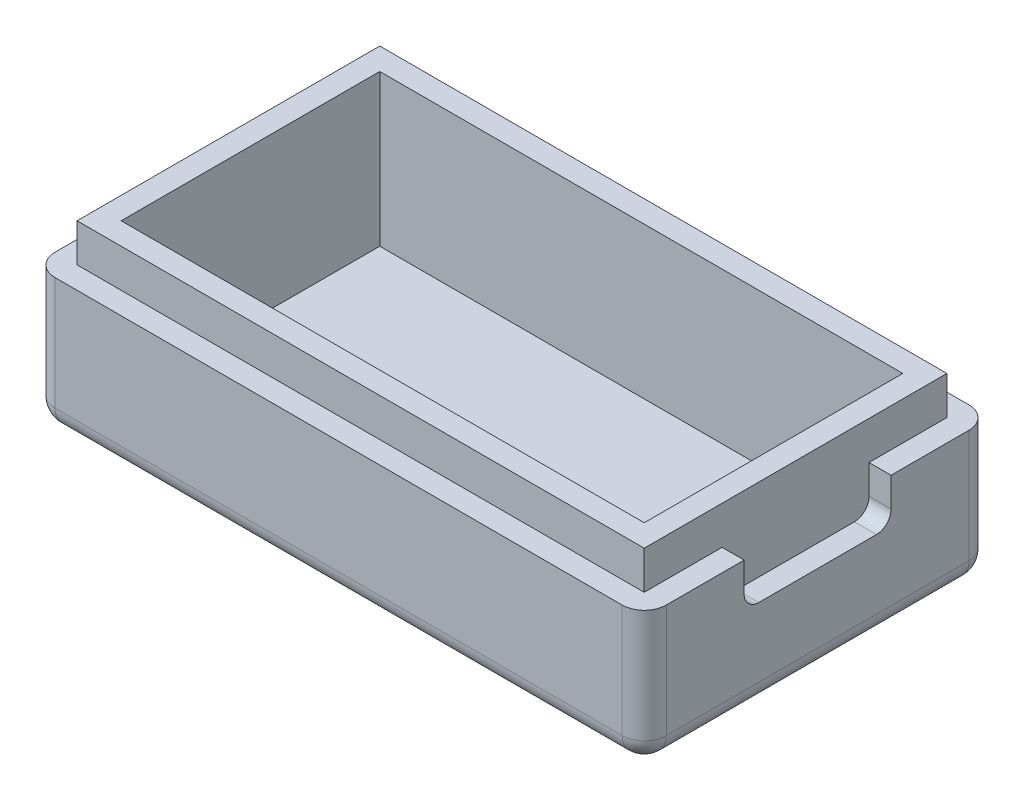
ISO-10303-21;
HEADER;
FILE_DESCRIPTION(('STEP AP214'),'2;1');
FILE_NAME('part.step','',(''),(''),'','','');
FILE_SCHEMA(('AUTOMOTIVE_DESIGN { 1 0 10303 214 1 1 1 1 }'));
ENDSEC;
DATA;
#1=APPLICATION_CONTEXT('core data for automotive mechanical design processes');
#2=APPLICATION_PROTOCOL_DEFINITION('international standard','automotive_design',2000,#1);
#3=PRODUCT_CONTEXT('',#1,'mechanical');
#4=PRODUCT('Part','Part','',(#3));
#5=PRODUCT_RELATED_PRODUCT_CATEGORY('part','',(#4));
#6=PRODUCT_DEFINITION_FORMATION('','',#4);
#7=PRODUCT_DEFINITION_CONTEXT('part definition',#1,'design');
#8=PRODUCT_DEFINITION('design','',#6,#7);
#9=PRODUCT_DEFINITION_SHAPE('','',#8);
#10=(LENGTH_UNIT() NAMED_UNIT(*) SI_UNIT(.MILLI.,.METRE.));
#11=(NAMED_UNIT(*) PLANE_ANGLE_UNIT() SI_UNIT($,.RADIAN.));
#12=(NAMED_UNIT(*) SI_UNIT($,.STERADIAN.) SOLID_ANGLE_UNIT());
#13=UNCERTAINTY_MEASURE_WITH_UNIT(LENGTH_MEASURE(1.E-05),#10,'distance_accuracy_value','');
#14=(GEOMETRIC_REPRESENTATION_CONTEXT(3) GLOBAL_UNCERTAINTY_ASSIGNED_CONTEXT((#13)) GLOBAL_UNIT_ASSIGNED_CONTEXT((#10,
#11,#12)) REPRESENTATION_CONTEXT('',''));
#15=CARTESIAN_POINT('',(0.,0.,0.));
#16=DIRECTION('',(0.,0.,1.));
#17=DIRECTION('',(1.,0.,0.));
#18=AXIS2_PLACEMENT_3D('',#15,#16,#17);
#19=CARTESIAN_POINT('',(0.,9.2,0.));
#20=DIRECTION('',(0.,1.,0.));
#21=DIRECTION('',(0.,0.,1.));
#22=AXIS2_PLACEMENT_3D('',#19,#20,#21);
#23=PLANE('',#22);
#24=DIRECTION('',(1.,0.,0.));
#25=VECTOR('',#24,1.);
#26=CARTESIAN_POINT('',(29.6596934910894,9.2,-6.80000000000002));
#27=LINE('',#26,#25);
#28=CARTESIAN_POINT('',(40.1,9.2,-6.80000000000002));
#29=VERTEX_POINT('',#28);
#30=CARTESIAN_POINT('',(41.6,9.2,-6.80000000000002));
#31=VERTEX_POINT('',#30);
#32=EDGE_CURVE('E263',#29,#31,#27,.T.);
#33=ORIENTED_EDGE('',*,*,#32,.F.);
#34=DIRECTION('',(0.,0.,-1.));
#35=VECTOR('',#34,1.);
#36=CARTESIAN_POINT('',(40.1,9.2,-22.1));
#37=LINE('',#36,#35);
#38=CARTESIAN_POINT('',(40.1,9.2,-1.5));
#39=VERTEX_POINT('',#38);
#40=EDGE_CURVE('E319',#39,#29,#37,.T.);
#41=ORIENTED_EDGE('',*,*,#40,.F.);
#42=DIRECTION('',(1.,0.,0.));
#43=VECTOR('',#42,1.);
#44=CARTESIAN_POINT('',(1.5,9.2,-1.5));
#45=LINE('',#44,#43);
#46=CARTESIAN_POINT('',(1.5,9.2,-1.5));
#47=VERTEX_POINT('',#46);
#48=EDGE_CURVE('E314',#47,#39,#45,.T.);
#49=ORIENTED_EDGE('',*,*,#48,.F.);
#50=DIRECTION('',(0.,0.,1.));
#51=VECTOR('',#50,1.);
#52=CARTESIAN_POINT('',(1.5,9.2,-22.1));
#53=LINE('',#52,#51);
#54=CARTESIAN_POINT('',(1.5,9.2,-6.8));
#55=VERTEX_POINT('',#54);
#56=EDGE_CURVE('E315',#55,#47,#53,.T.);
#57=ORIENTED_EDGE('',*,*,#56,.F.);
#58=DIRECTION('',(-1.,0.,0.));
#59=VECTOR('',#58,1.);
#60=CARTESIAN_POINT('',(11.9403065089106,9.2,-6.80000000000001));
#61=LINE('',#60,#59);
#62=CARTESIAN_POINT('',(0.,9.2,-6.8));
#63=VERTEX_POINT('',#62);
#64=EDGE_CURVE('E299',#55,#63,#61,.T.);
#65=ORIENTED_EDGE('',*,*,#64,.T.);
#66=DIRECTION('',(0.,0.,1.));
#67=VECTOR('',#66,1.);
#68=CARTESIAN_POINT('',(0.,9.2,-23.6));
#69=LINE('',#68,#67);
#70=CARTESIAN_POINT('',(0.,9.2,-1.5));
#71=VERTEX_POINT('',#70);
#72=EDGE_CURVE('E340',#63,#71,#69,.T.);
#73=ORIENTED_EDGE('',*,*,#72,.T.);
#74=CARTESIAN_POINT('',(1.5,9.2,-1.5));
#75=DIRECTION('',(0.,1.,0.));
#76=DIRECTION('',(0.,0.,1.));
#77=AXIS2_PLACEMENT_3D('',#74,#75,#76);
#78=CIRCLE('',#77,1.5);
#79=CARTESIAN_POINT('',(1.5,9.2,0.));
#80=VERTEX_POINT('',#79);
#81=EDGE_CURVE('E43',#71,#80,#78,.T.);
#82=ORIENTED_EDGE('',*,*,#81,.T.);
#83=DIRECTION('',(1.,0.,0.));
#84=VECTOR('',#83,1.);
#85=CARTESIAN_POINT('',(0.,9.2,0.));
#86=LINE('',#85,#84);
#87=CARTESIAN_POINT('',(40.1,9.2,0.));
#88=VERTEX_POINT('',#87);
#89=EDGE_CURVE('E350',#80,#88,#86,.T.);
#90=ORIENTED_EDGE('',*,*,#89,.T.);
#91=CARTESIAN_POINT('',(40.1,9.2,-1.5));
#92=DIRECTION('',(0.,1.,0.));
#93=DIRECTION('',(0.,0.,1.));
#94=AXIS2_PLACEMENT_3D('',#91,#92,#93);
#95=CIRCLE('',#94,1.5);
#96=CARTESIAN_POINT('',(41.6,9.2,-1.5));
#97=VERTEX_POINT('',#96);
#98=EDGE_CURVE('E11',#88,#97,#95,.T.);
#99=ORIENTED_EDGE('',*,*,#98,.T.);
#100=DIRECTION('',(0.,0.,-1.));
#101=VECTOR('',#100,1.);
#102=CARTESIAN_POINT('',(41.6,9.2,-23.6));
#103=LINE('',#102,#101);
#104=EDGE_CURVE('E354',#97,#31,#103,.T.);
#105=ORIENTED_EDGE('',*,*,#104,.T.);
#106=EDGE_LOOP('',(#33,#41,#49,#57,#65,#73,#82,#90,#99,#105));
#107=FACE_BOUND('',#106,.T.);
#108=ADVANCED_FACE('F34',(#107),#23,.T.);
#109=CARTESIAN_POINT('',(0.,11.8,0.));
#110=DIRECTION('',(0.,-1.,0.));
#111=DIRECTION('',(0.,0.,-1.));
#112=AXIS2_PLACEMENT_3D('',#109,#110,#111);
#113=PLANE('',#112);
#114=DIRECTION('',(-1.,0.,0.));
#115=VECTOR('',#114,1.);
#116=CARTESIAN_POINT('',(2.99999999999999,11.8,-20.6));
#117=LINE('',#116,#115);
#118=CARTESIAN_POINT('',(38.6,11.8,-20.6));
#119=VERTEX_POINT('',#118);
#120=CARTESIAN_POINT('',(2.99999999999999,11.8,-20.6));
#121=VERTEX_POINT('',#120);
#122=EDGE_CURVE('E376',#119,#121,#117,.T.);
#123=ORIENTED_EDGE('',*,*,#122,.F.);
#124=DIRECTION('',(0.,0.,-1.));
#125=VECTOR('',#124,1.);
#126=CARTESIAN_POINT('',(38.6,11.8,-3.00000000000001));
#127=LINE('',#126,#125);
#128=CARTESIAN_POINT('',(38.6,11.8,-3.00000000000001));
#129=VERTEX_POINT('',#128);
#130=EDGE_CURVE('E360',#129,#119,#127,.T.);
#131=ORIENTED_EDGE('',*,*,#130,.F.);
#132=DIRECTION('',(1.,0.,0.));
#133=VECTOR('',#132,1.);
#134=CARTESIAN_POINT('',(2.99999999999999,11.8,-3.00000000000001));
#135=LINE('',#134,#133);
#136=CARTESIAN_POINT('',(2.99999999999999,11.8,-3.00000000000001));
#137=VERTEX_POINT('',#136);
#138=EDGE_CURVE('E365',#137,#129,#135,.T.);
#139=ORIENTED_EDGE('',*,*,#138,.F.);
#140=DIRECTION('',(0.,0.,1.));
#141=VECTOR('',#140,1.);
#142=CARTESIAN_POINT('',(2.99999999999999,11.8,-3.00000000000001));
#143=LINE('',#142,#141);
#144=EDGE_CURVE('E379',#121,#137,#143,.T.);
#145=ORIENTED_EDGE('',*,*,#144,.F.);
#146=EDGE_LOOP('',(#123,#131,#139,#145));
#147=FACE_BOUND('',#146,.T.);
#148=DIRECTION('',(0.,0.,1.));
#149=VECTOR('',#148,1.);
#150=CARTESIAN_POINT('',(1.5,11.8,-22.1));
#151=LINE('',#150,#149);
#152=CARTESIAN_POINT('',(1.5,11.8,-22.1));
#153=VERTEX_POINT('',#152);
#154=CARTESIAN_POINT('',(1.5,11.8,-1.5));
#155=VERTEX_POINT('',#154);
#156=EDGE_CURVE('E326',#153,#155,#151,.T.);
#157=ORIENTED_EDGE('',*,*,#156,.T.);
#158=DIRECTION('',(1.,0.,0.));
#159=VECTOR('',#158,1.);
#160=CARTESIAN_POINT('',(1.5,11.8,-1.5));
#161=LINE('',#160,#159);
#162=CARTESIAN_POINT('',(40.1,11.8,-1.5));
#163=VERTEX_POINT('',#162);
#164=EDGE_CURVE('E329',#155,#163,#161,.T.);
#165=ORIENTED_EDGE('',*,*,#164,.T.);
#166=DIRECTION('',(0.,0.,-1.));
#167=VECTOR('',#166,1.);
#168=CARTESIAN_POINT('',(40.1,11.8,-22.1));
#169=LINE('',#168,#167);
#170=CARTESIAN_POINT('',(40.1,11.8,-22.1));
#171=VERTEX_POINT('',#170);
#172=EDGE_CURVE('E332',#163,#171,#169,.T.);
#173=ORIENTED_EDGE('',*,*,#172,.T.);
#174=DIRECTION('',(-1.,0.,0.));
#175=VECTOR('',#174,1.);
#176=CARTESIAN_POINT('',(1.5,11.8,-22.1));
#177=LINE('',#176,#175);
#178=EDGE_CURVE('E335',#171,#153,#177,.T.);
#179=ORIENTED_EDGE('',*,*,#178,.T.);
#180=EDGE_LOOP('',(#157,#165,#173,#179));
#181=FACE_BOUND('',#180,.T.);
#182=ADVANCED_FACE('F533',(#147,#181),#113,.F.);
#183=CARTESIAN_POINT('',(38.6,1.5,-3.00000000000001));
#184=DIRECTION('',(1.,0.,0.));
#185=DIRECTION('',(0.,0.,-1.));
#186=AXIS2_PLACEMENT_3D('',#183,#184,#185);
#187=PLANE('',#186);
#188=ORIENTED_EDGE('',*,*,#130,.T.);
#189=DIRECTION('',(0.,1.,0.));
#190=VECTOR('',#189,1.);
#191=CARTESIAN_POINT('',(38.6,1.5,-20.6));
#192=LINE('',#191,#190);
#193=CARTESIAN_POINT('',(38.6,1.5,-20.6));
#194=VERTEX_POINT('',#193);
#195=EDGE_CURVE('E374',#194,#119,#192,.T.);
#196=ORIENTED_EDGE('',*,*,#195,.F.);
#197=DIRECTION('',(0.,0.,-1.));
#198=VECTOR('',#197,1.);
#199=CARTESIAN_POINT('',(38.6,1.5,-3.00000000000001));
#200=LINE('',#199,#198);
#201=CARTESIAN_POINT('',(38.6,1.5,-3.00000000000001));
#202=VERTEX_POINT('',#201);
#203=EDGE_CURVE('E361',#202,#194,#200,.T.);
#204=ORIENTED_EDGE('',*,*,#203,.F.);
#205=DIRECTION('',(0.,1.,0.));
#206=VECTOR('',#205,1.);
#207=CARTESIAN_POINT('',(38.6,1.5,-3.00000000000001));
#208=LINE('',#207,#206);
#209=EDGE_CURVE('E384',#202,#129,#208,.T.);
#210=ORIENTED_EDGE('',*,*,#209,.T.);
#211=EDGE_LOOP('',(#188,#196,#204,#210));
#212=FACE_BOUND('',#211,.T.);
#213=ADVANCED_FACE('F539',(#212),#187,.F.);
#214=CARTESIAN_POINT('',(2.99999999999999,1.5,-3.00000000000001));
#215=DIRECTION('',(0.,0.,1.));
#216=DIRECTION('',(1.,0.,0.));
#217=AXIS2_PLACEMENT_3D('',#214,#215,#216);
#218=PLANE('',#217);
#219=ORIENTED_EDGE('',*,*,#138,.T.);
#220=ORIENTED_EDGE('',*,*,#209,.F.);
#221=DIRECTION('',(1.,0.,0.));
#222=VECTOR('',#221,1.);
#223=CARTESIAN_POINT('',(2.99999999999999,1.5,-3.00000000000001));
#224=LINE('',#223,#222);
#225=CARTESIAN_POINT('',(2.99999999999999,1.5,-3.00000000000001));
#226=VERTEX_POINT('',#225);
#227=EDGE_CURVE('E371',#226,#202,#224,.T.);
#228=ORIENTED_EDGE('',*,*,#227,.F.);
#229=DIRECTION('',(0.,1.,0.));
#230=VECTOR('',#229,1.);
#231=CARTESIAN_POINT('',(2.99999999999999,1.5,-3.00000000000001));
#232=LINE('',#231,#230);
#233=EDGE_CURVE('E387',#226,#137,#232,.T.);
#234=ORIENTED_EDGE('',*,*,#233,.T.);
#235=EDGE_LOOP('',(#219,#220,#228,#234));
#236=FACE_BOUND('',#235,.T.);
#237=ADVANCED_FACE('F738',(#236),#218,.F.);
#238=CARTESIAN_POINT('',(2.99999999999999,1.5,-3.00000000000001));
#239=DIRECTION('',(-1.,0.,0.));
#240=DIRECTION('',(0.,0.,1.));
#241=AXIS2_PLACEMENT_3D('',#238,#239,#240);
#242=PLANE('',#241);
#243=ORIENTED_EDGE('',*,*,#144,.T.);
#244=ORIENTED_EDGE('',*,*,#233,.F.);
#245=DIRECTION('',(0.,0.,1.));
#246=VECTOR('',#245,1.);
#247=CARTESIAN_POINT('',(2.99999999999999,1.5,-3.00000000000001));
#248=LINE('',#247,#246);
#249=CARTESIAN_POINT('',(2.99999999999999,1.5,-20.6));
#250=VERTEX_POINT('',#249);
#251=EDGE_CURVE('E368',#250,#226,#248,.T.);
#252=ORIENTED_EDGE('',*,*,#251,.F.);
#253=DIRECTION('',(0.,1.,0.));
#254=VECTOR('',#253,1.);
#255=CARTESIAN_POINT('',(2.99999999999999,1.5,-20.6));
#256=LINE('',#255,#254);
#257=EDGE_CURVE('E389',#250,#121,#256,.T.);
#258=ORIENTED_EDGE('',*,*,#257,.T.);
#259=EDGE_LOOP('',(#243,#244,#252,#258));
#260=FACE_BOUND('',#259,.T.);
#261=ADVANCED_FACE('F728',(#260),#242,.F.);
#262=CARTESIAN_POINT('',(2.99999999999999,1.5,-20.6));
#263=DIRECTION('',(0.,0.,-1.));
#264=DIRECTION('',(-1.,0.,0.));
#265=AXIS2_PLACEMENT_3D('',#262,#263,#264);
#266=PLANE('',#265);
#267=ORIENTED_EDGE('',*,*,#122,.T.);
#268=ORIENTED_EDGE('',*,*,#257,.F.);
#269=DIRECTION('',(-1.,0.,0.));
#270=VECTOR('',#269,1.);
#271=CARTESIAN_POINT('',(2.99999999999999,1.5,-20.6));
#272=LINE('',#271,#270);
#273=EDGE_CURVE('E364',#194,#250,#272,.T.);
#274=ORIENTED_EDGE('',*,*,#273,.F.);
#275=ORIENTED_EDGE('',*,*,#195,.T.);
#276=EDGE_LOOP('',(#267,#268,#274,#275));
#277=FACE_BOUND('',#276,.T.);
#278=ADVANCED_FACE('F554',(#277),#266,.F.);
#279=CARTESIAN_POINT('',(0.,1.5,0.));
#280=DIRECTION('',(0.,-1.,0.));
#281=DIRECTION('',(0.,0.,-1.));
#282=AXIS2_PLACEMENT_3D('',#279,#280,#281);
#283=PLANE('',#282);
#284=ORIENTED_EDGE('',*,*,#203,.T.);
#285=ORIENTED_EDGE('',*,*,#273,.T.);
#286=ORIENTED_EDGE('',*,*,#251,.T.);
#287=ORIENTED_EDGE('',*,*,#227,.T.);
#288=EDGE_LOOP('',(#284,#285,#286,#287));
#289=FACE_BOUND('',#288,.T.);
#290=ADVANCED_FACE('F546',(#289),#283,.F.);
#291=DIRECTION('',(1.,0.,0.));
#292=VECTOR('',#291,1.);
#293=CARTESIAN_POINT('',(29.6596934910894,9.2,-16.8));
#294=LINE('',#293,#292);
#295=CARTESIAN_POINT('',(40.1,9.2,-16.8));
#296=VERTEX_POINT('',#295);
#297=CARTESIAN_POINT('',(41.6,9.2,-16.8));
#298=VERTEX_POINT('',#297);
#299=EDGE_CURVE('E265',#296,#298,#294,.T.);
#300=ORIENTED_EDGE('',*,*,#299,.T.);
#301=CARTESIAN_POINT('',(41.6,9.2,-22.1));
#302=VERTEX_POINT('',#301);
#303=EDGE_CURVE('E353',#298,#302,#103,.T.);
#304=ORIENTED_EDGE('',*,*,#303,.T.);
#305=CARTESIAN_POINT('',(40.1,9.2,-22.1));
#306=DIRECTION('',(0.,1.,0.));
#307=DIRECTION('',(0.,0.,1.));
#308=AXIS2_PLACEMENT_3D('',#305,#306,#307);
#309=CIRCLE('',#308,1.5);
#310=CARTESIAN_POINT('',(40.1,9.2,-23.6));
#311=VERTEX_POINT('',#310);
#312=EDGE_CURVE('E428',#302,#311,#309,.T.);
#313=ORIENTED_EDGE('',*,*,#312,.T.);
#314=DIRECTION('',(-1.,0.,0.));
#315=VECTOR('',#314,1.);
#316=CARTESIAN_POINT('',(0.,9.2,-23.6));
#317=LINE('',#316,#315);
#318=CARTESIAN_POINT('',(1.49999999999999,9.2,-23.6));
#319=VERTEX_POINT('',#318);
#320=EDGE_CURVE('E357',#311,#319,#317,.T.);
#321=ORIENTED_EDGE('',*,*,#320,.T.);
#322=CARTESIAN_POINT('',(1.49999999999999,9.2,-22.1));
#323=DIRECTION('',(0.,1.,0.));
#324=DIRECTION('',(0.,0.,1.));
#325=AXIS2_PLACEMENT_3D('',#322,#323,#324);
#326=CIRCLE('',#325,1.5);
#327=CARTESIAN_POINT('',(0.,9.2,-22.1));
#328=VERTEX_POINT('',#327);
#329=EDGE_CURVE('E430',#319,#328,#326,.T.);
#330=ORIENTED_EDGE('',*,*,#329,.T.);
#331=CARTESIAN_POINT('',(0.,9.2,-16.8));
#332=VERTEX_POINT('',#331);
#333=EDGE_CURVE('E347',#328,#332,#69,.T.);
#334=ORIENTED_EDGE('',*,*,#333,.T.);
#335=DIRECTION('',(-1.,0.,0.));
#336=VECTOR('',#335,1.);
#337=CARTESIAN_POINT('',(11.9403065089105,9.2,-16.8));
#338=LINE('',#337,#336);
#339=CARTESIAN_POINT('',(1.5,9.2,-16.8));
#340=VERTEX_POINT('',#339);
#341=EDGE_CURVE('E278',#340,#332,#338,.T.);
#342=ORIENTED_EDGE('',*,*,#341,.F.);
#343=CARTESIAN_POINT('',(1.5,9.2,-22.1));
#344=VERTEX_POINT('',#343);
#345=EDGE_CURVE('E311',#344,#340,#53,.T.);
#346=ORIENTED_EDGE('',*,*,#345,.F.);
#347=DIRECTION('',(-1.,0.,0.));
#348=VECTOR('',#347,1.);
#349=CARTESIAN_POINT('',(1.5,9.2,-22.1));
#350=LINE('',#349,#348);
#351=CARTESIAN_POINT('',(40.1,9.2,-22.1));
#352=VERTEX_POINT('',#351);
#353=EDGE_CURVE('E322',#352,#344,#350,.T.);
#354=ORIENTED_EDGE('',*,*,#353,.F.);
#355=EDGE_CURVE('E318',#296,#352,#37,.T.);
#356=ORIENTED_EDGE('',*,*,#355,.F.);
#357=EDGE_LOOP('',(#300,#304,#313,#321,#330,#334,#342,#346,#354,#356));
#358=FACE_BOUND('',#357,.T.);
#359=ADVANCED_FACE('F535',(#358),#23,.T.);
#360=CARTESIAN_POINT('',(1.5,9.2,-22.1));
#361=DIRECTION('',(-1.,0.,0.));
#362=DIRECTION('',(0.,0.,1.));
#363=AXIS2_PLACEMENT_3D('',#360,#361,#362);
#364=PLANE('',#363);
#365=ORIENTED_EDGE('',*,*,#156,.F.);
#366=DIRECTION('',(0.,1.,0.));
#367=VECTOR('',#366,1.);
#368=CARTESIAN_POINT('',(1.5,9.2,-22.1));
#369=LINE('',#368,#367);
#370=EDGE_CURVE('E338',#344,#153,#369,.T.);
#371=ORIENTED_EDGE('',*,*,#370,.F.);
#372=ORIENTED_EDGE('',*,*,#345,.T.);
#373=DIRECTION('',(0.,1.,0.));
#374=VECTOR('',#373,1.);
#375=CARTESIAN_POINT('',(1.5,9.2,-16.8));
#376=LINE('',#375,#374);
#377=CARTESIAN_POINT('',(1.5,7.20000000000001,-16.8));
#378=VERTEX_POINT('',#377);
#379=EDGE_CURVE('E282',#378,#340,#376,.T.);
#380=ORIENTED_EDGE('',*,*,#379,.F.);
#381=CARTESIAN_POINT('',(1.5,7.2,-15.8));
#382=DIRECTION('',(-1.,0.,0.));
#383=DIRECTION('',(0.,0.,1.));
#384=AXIS2_PLACEMENT_3D('',#381,#382,#383);
#385=CIRCLE('',#384,1.);
#386=CARTESIAN_POINT('',(1.5,6.2,-15.8));
#387=VERTEX_POINT('',#386);
#388=EDGE_CURVE('E284',#387,#378,#385,.F.);
#389=ORIENTED_EDGE('',*,*,#388,.F.);
#390=DIRECTION('',(0.,0.,-1.));
#391=VECTOR('',#390,1.);
#392=CARTESIAN_POINT('',(1.5,6.2,-15.8));
#393=LINE('',#392,#391);
#394=CARTESIAN_POINT('',(1.5,6.2,-7.80000000000001));
#395=VERTEX_POINT('',#394);
#396=EDGE_CURVE('E275',#395,#387,#393,.T.);
#397=ORIENTED_EDGE('',*,*,#396,.F.);
#398=CARTESIAN_POINT('',(1.5,7.2,-7.8));
#399=DIRECTION('',(-1.,0.,0.));
#400=DIRECTION('',(0.,0.,1.));
#401=AXIS2_PLACEMENT_3D('',#398,#399,#400);
#402=CIRCLE('',#401,1.);
#403=CARTESIAN_POINT('',(1.5,7.2,-6.8));
#404=VERTEX_POINT('',#403);
#405=EDGE_CURVE('E277',#404,#395,#402,.F.);
#406=ORIENTED_EDGE('',*,*,#405,.F.);
#407=DIRECTION('',(0.,-1.,0.));
#408=VECTOR('',#407,1.);
#409=CARTESIAN_POINT('',(1.5,9.2,-6.8));
#410=LINE('',#409,#408);
#411=EDGE_CURVE('E280',#55,#404,#410,.T.);
#412=ORIENTED_EDGE('',*,*,#411,.F.);
#413=ORIENTED_EDGE('',*,*,#56,.T.);
#414=DIRECTION('',(0.,1.,0.));
#415=VECTOR('',#414,1.);
#416=CARTESIAN_POINT('',(1.5,9.2,-1.5));
#417=LINE('',#416,#415);
#418=EDGE_CURVE('E325',#47,#155,#417,.T.);
#419=ORIENTED_EDGE('',*,*,#418,.T.);
#420=EDGE_LOOP('',(#365,#371,#372,#380,#389,#397,#406,#412,#413,#419));
#421=FACE_BOUND('',#420,.T.);
#422=ADVANCED_FACE('F545',(#421),#364,.T.);
#423=CARTESIAN_POINT('',(1.5,9.2,-22.1));
#424=DIRECTION('',(0.,0.,-1.));
#425=DIRECTION('',(-1.,0.,0.));
#426=AXIS2_PLACEMENT_3D('',#423,#424,#425);
#427=PLANE('',#426);
#428=ORIENTED_EDGE('',*,*,#178,.F.);
#429=DIRECTION('',(0.,1.,0.));
#430=VECTOR('',#429,1.);
#431=CARTESIAN_POINT('',(40.1,9.2,-22.1));
#432=LINE('',#431,#430);
#433=EDGE_CURVE('E341',#352,#171,#432,.T.);
#434=ORIENTED_EDGE('',*,*,#433,.F.);
#435=ORIENTED_EDGE('',*,*,#353,.T.);
#436=ORIENTED_EDGE('',*,*,#370,.T.);
#437=EDGE_LOOP('',(#428,#434,#435,#436));
#438=FACE_BOUND('',#437,.T.);
#439=ADVANCED_FACE('F552',(#438),#427,.T.);
#440=CARTESIAN_POINT('',(40.1,9.2,-22.1));
#441=DIRECTION('',(1.,0.,0.));
#442=DIRECTION('',(0.,0.,-1.));
#443=AXIS2_PLACEMENT_3D('',#440,#441,#442);
#444=PLANE('',#443);
#445=ORIENTED_EDGE('',*,*,#172,.F.);
#446=DIRECTION('',(0.,1.,0.));
#447=VECTOR('',#446,1.);
#448=CARTESIAN_POINT('',(40.1,9.2,-1.5));
#449=LINE('',#448,#447);
#450=EDGE_CURVE('E343',#39,#163,#449,.T.);
#451=ORIENTED_EDGE('',*,*,#450,.F.);
#452=ORIENTED_EDGE('',*,*,#40,.T.);
#453=DIRECTION('',(0.,1.,0.));
#454=VECTOR('',#453,1.);
#455=CARTESIAN_POINT('',(40.1,9.2,-6.80000000000002));
#456=LINE('',#455,#454);
#457=CARTESIAN_POINT('',(40.1,7.20000000000001,-6.80000000000002));
#458=VERTEX_POINT('',#457);
#459=EDGE_CURVE('E274',#458,#29,#456,.T.);
#460=ORIENTED_EDGE('',*,*,#459,.F.);
#461=CARTESIAN_POINT('',(40.1,7.2,-7.80000000000002));
#462=DIRECTION('',(1.,0.,0.));
#463=DIRECTION('',(0.,0.,-1.));
#464=AXIS2_PLACEMENT_3D('',#461,#462,#463);
#465=CIRCLE('',#464,1.);
#466=CARTESIAN_POINT('',(40.1,6.2,-7.80000000000003));
#467=VERTEX_POINT('',#466);
#468=EDGE_CURVE('E272',#467,#458,#465,.F.);
#469=ORIENTED_EDGE('',*,*,#468,.F.);
#470=DIRECTION('',(0.,0.,1.));
#471=VECTOR('',#470,1.);
#472=CARTESIAN_POINT('',(40.1,6.2,-7.80000000000002));
#473=LINE('',#472,#471);
#474=CARTESIAN_POINT('',(40.1,6.2,-15.8));
#475=VERTEX_POINT('',#474);
#476=EDGE_CURVE('E242',#475,#467,#473,.T.);
#477=ORIENTED_EDGE('',*,*,#476,.F.);
#478=CARTESIAN_POINT('',(40.1,7.2,-15.8));
#479=DIRECTION('',(1.,0.,0.));
#480=DIRECTION('',(0.,0.,-1.));
#481=AXIS2_PLACEMENT_3D('',#478,#479,#480);
#482=CIRCLE('',#481,1.);
#483=CARTESIAN_POINT('',(40.1,7.2,-16.8));
#484=VERTEX_POINT('',#483);
#485=EDGE_CURVE('E506',#484,#475,#482,.F.);
#486=ORIENTED_EDGE('',*,*,#485,.F.);
#487=DIRECTION('',(0.,-1.,0.));
#488=VECTOR('',#487,1.);
#489=CARTESIAN_POINT('',(40.1,9.2,-16.8));
#490=LINE('',#489,#488);
#491=EDGE_CURVE('E504',#296,#484,#490,.T.);
#492=ORIENTED_EDGE('',*,*,#491,.F.);
#493=ORIENTED_EDGE('',*,*,#355,.T.);
#494=ORIENTED_EDGE('',*,*,#433,.T.);
#495=EDGE_LOOP('',(#445,#451,#452,#460,#469,#477,#486,#492,#493,#494));
#496=FACE_BOUND('',#495,.T.);
#497=ADVANCED_FACE('F513',(#496),#444,.T.);
#498=CARTESIAN_POINT('',(1.5,9.2,-1.5));
#499=DIRECTION('',(0.,0.,1.));
#500=DIRECTION('',(1.,0.,0.));
#501=AXIS2_PLACEMENT_3D('',#498,#499,#500);
#502=PLANE('',#501);
#503=ORIENTED_EDGE('',*,*,#164,.F.);
#504=ORIENTED_EDGE('',*,*,#418,.F.);
#505=ORIENTED_EDGE('',*,*,#48,.T.);
#506=ORIENTED_EDGE('',*,*,#450,.T.);
#507=EDGE_LOOP('',(#503,#504,#505,#506));
#508=FACE_BOUND('',#507,.T.);
#509=ADVANCED_FACE('F587',(#508),#502,.T.);
#510=CARTESIAN_POINT('',(0.,0.,0.));
#511=DIRECTION('',(0.,-1.,0.));
#512=DIRECTION('',(0.,0.,-1.));
#513=AXIS2_PLACEMENT_3D('',#510,#511,#512);
#514=PLANE('',#513);
#515=DIRECTION('',(0.,0.,-1.));
#516=VECTOR('',#515,1.);
#517=CARTESIAN_POINT('',(40.1,0.,0.));
#518=LINE('',#517,#516);
#519=CARTESIAN_POINT('',(40.1,0.,-22.1));
#520=VERTEX_POINT('',#519);
#521=CARTESIAN_POINT('',(40.1,0.,-1.5));
#522=VERTEX_POINT('',#521);
#523=EDGE_CURVE('E403',#520,#522,#518,.F.);
#524=ORIENTED_EDGE('',*,*,#523,.T.);
#525=DIRECTION('',(1.,0.,0.));
#526=VECTOR('',#525,1.);
#527=CARTESIAN_POINT('',(0.,0.,-1.5));
#528=LINE('',#527,#526);
#529=CARTESIAN_POINT('',(1.5,0.,-1.5));
#530=VERTEX_POINT('',#529);
#531=EDGE_CURVE('E405',#522,#530,#528,.F.);
#532=ORIENTED_EDGE('',*,*,#531,.T.);
#533=DIRECTION('',(0.,0.,1.));
#534=VECTOR('',#533,1.);
#535=CARTESIAN_POINT('',(1.49999999999999,0.,-23.6));
#536=LINE('',#535,#534);
#537=CARTESIAN_POINT('',(1.49999999999999,0.,-22.1));
#538=VERTEX_POINT('',#537);
#539=EDGE_CURVE('E399',#530,#538,#536,.F.);
#540=ORIENTED_EDGE('',*,*,#539,.T.);
#541=DIRECTION('',(-1.,0.,0.));
#542=VECTOR('',#541,1.);
#543=CARTESIAN_POINT('',(41.6,0.,-22.1));
#544=LINE('',#543,#542);
#545=EDGE_CURVE('E401',#538,#520,#544,.F.);
#546=ORIENTED_EDGE('',*,*,#545,.T.);
#547=EDGE_LOOP('',(#524,#532,#540,#546));
#548=FACE_BOUND('',#547,.T.);
#549=ADVANCED_FACE('F617',(#548),#514,.T.);
#550=CARTESIAN_POINT('',(0.,11.8,-23.6));
#551=DIRECTION('',(0.,0.,1.));
#552=DIRECTION('',(1.,0.,0.));
#553=AXIS2_PLACEMENT_3D('',#550,#551,#552);
#554=PLANE('',#553);
#555=DIRECTION('',(-1.,0.,0.));
#556=VECTOR('',#555,1.);
#557=CARTESIAN_POINT('',(0.,1.5,-23.6));
#558=LINE('',#557,#556);
#559=CARTESIAN_POINT('',(40.1,1.5,-23.6));
#560=VERTEX_POINT('',#559);
#561=CARTESIAN_POINT('',(1.49999999999999,1.5,-23.6));
#562=VERTEX_POINT('',#561);
#563=EDGE_CURVE('E417',#560,#562,#558,.T.);
#564=ORIENTED_EDGE('',*,*,#563,.T.);
#565=DIRECTION('',(0.,-1.,0.));
#566=VECTOR('',#565,1.);
#567=CARTESIAN_POINT('',(1.49999999999999,11.8,-23.6));
#568=LINE('',#567,#566);
#569=EDGE_CURVE('E419',#562,#319,#568,.F.);
#570=ORIENTED_EDGE('',*,*,#569,.T.);
#571=ORIENTED_EDGE('',*,*,#320,.F.);
#572=DIRECTION('',(0.,-1.,0.));
#573=VECTOR('',#572,1.);
#574=CARTESIAN_POINT('',(40.1,11.8,-23.6));
#575=LINE('',#574,#573);
#576=EDGE_CURVE('E415',#311,#560,#575,.T.);
#577=ORIENTED_EDGE('',*,*,#576,.T.);
#578=EDGE_LOOP('',(#564,#570,#571,#577));
#579=FACE_BOUND('',#578,.T.);
#580=ADVANCED_FACE('F569',(#579),#554,.F.);
#581=CARTESIAN_POINT('',(41.6,11.8,0.));
#582=DIRECTION('',(-1.,0.,0.));
#583=DIRECTION('',(0.,0.,1.));
#584=AXIS2_PLACEMENT_3D('',#581,#582,#583);
#585=PLANE('',#584);
#586=CARTESIAN_POINT('',(41.6,7.2,-7.80000000000002));
#587=DIRECTION('',(1.,0.,0.));
#588=DIRECTION('',(0.,0.,-1.));
#589=AXIS2_PLACEMENT_3D('',#586,#587,#588);
#590=CIRCLE('',#589,1.);
#591=CARTESIAN_POINT('',(41.6,7.2,-6.80000000000002));
#592=VERTEX_POINT('',#591);
#593=CARTESIAN_POINT('',(41.6,6.2,-7.80000000000003));
#594=VERTEX_POINT('',#593);
#595=EDGE_CURVE('E249',#592,#594,#590,.T.);
#596=ORIENTED_EDGE('',*,*,#595,.F.);
#597=DIRECTION('',(0.,-1.,0.));
#598=VECTOR('',#597,1.);
#599=CARTESIAN_POINT('',(41.6,9.2,-6.80000000000002));
#600=LINE('',#599,#598);
#601=EDGE_CURVE('E51',#31,#592,#600,.T.);
#602=ORIENTED_EDGE('',*,*,#601,.F.);
#603=ORIENTED_EDGE('',*,*,#104,.F.);
#604=DIRECTION('',(0.,-1.,0.));
#605=VECTOR('',#604,1.);
#606=CARTESIAN_POINT('',(41.6,11.8,-1.5));
#607=LINE('',#606,#605);
#608=CARTESIAN_POINT('',(41.6,1.5,-1.5));
#609=VERTEX_POINT('',#608);
#610=EDGE_CURVE('E413',#97,#609,#607,.T.);
#611=ORIENTED_EDGE('',*,*,#610,.T.);
#612=DIRECTION('',(0.,0.,-1.));
#613=VECTOR('',#612,1.);
#614=CARTESIAN_POINT('',(41.6,1.5,-23.6));
#615=LINE('',#614,#613);
#616=CARTESIAN_POINT('',(41.6,1.5,-22.1));
#617=VERTEX_POINT('',#616);
#618=EDGE_CURVE('E411',#609,#617,#615,.T.);
#619=ORIENTED_EDGE('',*,*,#618,.T.);
#620=DIRECTION('',(0.,-1.,0.));
#621=VECTOR('',#620,1.);
#622=CARTESIAN_POINT('',(41.6,11.8,-22.1));
#623=LINE('',#622,#621);
#624=EDGE_CURVE('E408',#617,#302,#623,.F.);
#625=ORIENTED_EDGE('',*,*,#624,.T.);
#626=ORIENTED_EDGE('',*,*,#303,.F.);
#627=DIRECTION('',(0.,1.,0.));
#628=VECTOR('',#627,1.);
#629=CARTESIAN_POINT('',(41.6,9.2,-16.8));
#630=LINE('',#629,#628);
#631=CARTESIAN_POINT('',(41.6,7.20000000000001,-16.8));
#632=VERTEX_POINT('',#631);
#633=EDGE_CURVE('E258',#632,#298,#630,.T.);
#634=ORIENTED_EDGE('',*,*,#633,.F.);
#635=CARTESIAN_POINT('',(41.6,7.2,-15.8));
#636=DIRECTION('',(1.,0.,0.));
#637=DIRECTION('',(0.,0.,-1.));
#638=AXIS2_PLACEMENT_3D('',#635,#636,#637);
#639=CIRCLE('',#638,1.);
#640=CARTESIAN_POINT('',(41.6,6.2,-15.8));
#641=VERTEX_POINT('',#640);
#642=EDGE_CURVE('E256',#641,#632,#639,.T.);
#643=ORIENTED_EDGE('',*,*,#642,.F.);
#644=DIRECTION('',(0.,0.,-1.));
#645=VECTOR('',#644,1.);
#646=CARTESIAN_POINT('',(41.6,6.2,-7.80000000000003));
#647=LINE('',#646,#645);
#648=EDGE_CURVE('E239',#594,#641,#647,.T.);
#649=ORIENTED_EDGE('',*,*,#648,.F.);
#650=EDGE_LOOP('',(#596,#602,#603,#611,#619,#625,#626,#634,#643,#649));
#651=FACE_BOUND('',#650,.T.);
#652=ADVANCED_FACE('F253',(#651),#585,.F.);
#653=CARTESIAN_POINT('',(0.,11.8,0.));
#654=DIRECTION('',(0.,0.,-1.));
#655=DIRECTION('',(-1.,0.,0.));
#656=AXIS2_PLACEMENT_3D('',#653,#654,#655);
#657=PLANE('',#656);
#658=DIRECTION('',(1.,0.,0.));
#659=VECTOR('',#658,1.);
#660=CARTESIAN_POINT('',(41.6,1.5,0.));
#661=LINE('',#660,#659);
#662=CARTESIAN_POINT('',(1.5,1.5,0.));
#663=VERTEX_POINT('',#662);
#664=CARTESIAN_POINT('',(40.1,1.5,0.));
#665=VERTEX_POINT('',#664);
#666=EDGE_CURVE('E394',#663,#665,#661,.T.);
#667=ORIENTED_EDGE('',*,*,#666,.T.);
#668=DIRECTION('',(0.,-1.,0.));
#669=VECTOR('',#668,1.);
#670=CARTESIAN_POINT('',(40.1,11.8,0.));
#671=LINE('',#670,#669);
#672=EDGE_CURVE('E397',#665,#88,#671,.F.);
#673=ORIENTED_EDGE('',*,*,#672,.T.);
#674=ORIENTED_EDGE('',*,*,#89,.F.);
#675=DIRECTION('',(0.,-1.,0.));
#676=VECTOR('',#675,1.);
#677=CARTESIAN_POINT('',(1.5,11.8,0.));
#678=LINE('',#677,#676);
#679=EDGE_CURVE('E386',#80,#663,#678,.T.);
#680=ORIENTED_EDGE('',*,*,#679,.T.);
#681=EDGE_LOOP('',(#667,#673,#674,#680));
#682=FACE_BOUND('',#681,.T.);
#683=ADVANCED_FACE('F493',(#682),#657,.F.);
#684=CARTESIAN_POINT('',(0.,11.8,0.));
#685=DIRECTION('',(1.,0.,0.));
#686=DIRECTION('',(0.,0.,-1.));
#687=AXIS2_PLACEMENT_3D('',#684,#685,#686);
#688=PLANE('',#687);
#689=CARTESIAN_POINT('',(0.,7.2,-15.8));
#690=DIRECTION('',(-1.,0.,0.));
#691=DIRECTION('',(0.,0.,1.));
#692=AXIS2_PLACEMENT_3D('',#689,#690,#691);
#693=CIRCLE('',#692,1.);
#694=CARTESIAN_POINT('',(0.,7.2,-16.8));
#695=VERTEX_POINT('',#694);
#696=CARTESIAN_POINT('',(0.,6.2,-15.8));
#697=VERTEX_POINT('',#696);
#698=EDGE_CURVE('E286',#695,#697,#693,.T.);
#699=ORIENTED_EDGE('',*,*,#698,.F.);
#700=DIRECTION('',(0.,-1.,0.));
#701=VECTOR('',#700,1.);
#702=CARTESIAN_POINT('',(0.,9.2,-16.8));
#703=LINE('',#702,#701);
#704=EDGE_CURVE('E59',#332,#695,#703,.T.);
#705=ORIENTED_EDGE('',*,*,#704,.F.);
#706=ORIENTED_EDGE('',*,*,#333,.F.);
#707=DIRECTION('',(0.,-1.,0.));
#708=VECTOR('',#707,1.);
#709=CARTESIAN_POINT('',(0.,11.8,-22.1));
#710=LINE('',#709,#708);
#711=CARTESIAN_POINT('',(0.,1.5,-22.1));
#712=VERTEX_POINT('',#711);
#713=EDGE_CURVE('E421',#328,#712,#710,.T.);
#714=ORIENTED_EDGE('',*,*,#713,.T.);
#715=DIRECTION('',(0.,0.,1.));
#716=VECTOR('',#715,1.);
#717=CARTESIAN_POINT('',(0.,1.5,0.));
#718=LINE('',#717,#716);
#719=CARTESIAN_POINT('',(0.,1.5,-1.5));
#720=VERTEX_POINT('',#719);
#721=EDGE_CURVE('E423',#712,#720,#718,.T.);
#722=ORIENTED_EDGE('',*,*,#721,.T.);
#723=DIRECTION('',(0.,-1.,0.));
#724=VECTOR('',#723,1.);
#725=CARTESIAN_POINT('',(0.,11.8,-1.5));
#726=LINE('',#725,#724);
#727=EDGE_CURVE('E425',#720,#71,#726,.F.);
#728=ORIENTED_EDGE('',*,*,#727,.T.);
#729=ORIENTED_EDGE('',*,*,#72,.F.);
#730=DIRECTION('',(0.,1.,0.));
#731=VECTOR('',#730,1.);
#732=CARTESIAN_POINT('',(0.,9.2,-6.8));
#733=LINE('',#732,#731);
#734=CARTESIAN_POINT('',(0.,7.20000000000001,-6.8));
#735=VERTEX_POINT('',#734);
#736=EDGE_CURVE('E295',#735,#63,#733,.T.);
#737=ORIENTED_EDGE('',*,*,#736,.F.);
#738=CARTESIAN_POINT('',(0.,7.2,-7.8));
#739=DIRECTION('',(-1.,0.,0.));
#740=DIRECTION('',(0.,0.,1.));
#741=AXIS2_PLACEMENT_3D('',#738,#739,#740);
#742=CIRCLE('',#741,1.);
#743=CARTESIAN_POINT('',(0.,6.2,-7.80000000000001));
#744=VERTEX_POINT('',#743);
#745=EDGE_CURVE('E292',#744,#735,#742,.T.);
#746=ORIENTED_EDGE('',*,*,#745,.F.);
#747=DIRECTION('',(0.,0.,1.));
#748=VECTOR('',#747,1.);
#749=CARTESIAN_POINT('',(0.,6.2,-15.8));
#750=LINE('',#749,#748);
#751=EDGE_CURVE('E289',#697,#744,#750,.T.);
#752=ORIENTED_EDGE('',*,*,#751,.F.);
#753=EDGE_LOOP('',(#699,#705,#706,#714,#722,#728,#729,#737,#746,#752));
#754=FACE_BOUND('',#753,.T.);
#755=ADVANCED_FACE('F478',(#754),#688,.F.);
#756=CARTESIAN_POINT('',(1.49999999999999,11.8,-22.1));
#757=DIRECTION('',(0.,-1.,0.));
#758=DIRECTION('',(0.,0.,-1.));
#759=AXIS2_PLACEMENT_3D('',#756,#757,#758);
#760=CYLINDRICAL_SURFACE('',#759,1.5);
#761=ORIENTED_EDGE('',*,*,#329,.F.);
#762=ORIENTED_EDGE('',*,*,#569,.F.);
#763=CARTESIAN_POINT('',(1.49999999999999,1.5,-22.1));
#764=DIRECTION('',(0.,-1.,0.));
#765=DIRECTION('',(0.,0.,-1.));
#766=AXIS2_PLACEMENT_3D('',#763,#764,#765);
#767=CIRCLE('',#766,1.5);
#768=EDGE_CURVE('E459',#712,#562,#767,.T.);
#769=ORIENTED_EDGE('',*,*,#768,.F.);
#770=ORIENTED_EDGE('',*,*,#713,.F.);
#771=EDGE_LOOP('',(#761,#762,#769,#770));
#772=FACE_BOUND('',#771,.T.);
#773=ADVANCED_FACE('F36',(#772),#760,.T.);
#774=CARTESIAN_POINT('',(40.1,11.8,-22.1));
#775=DIRECTION('',(0.,-1.,0.));
#776=DIRECTION('',(0.,0.,-1.));
#777=AXIS2_PLACEMENT_3D('',#774,#775,#776);
#778=CYLINDRICAL_SURFACE('',#777,1.5);
#779=ORIENTED_EDGE('',*,*,#312,.F.);
#780=ORIENTED_EDGE('',*,*,#624,.F.);
#781=CARTESIAN_POINT('',(40.1,1.5,-22.1));
#782=DIRECTION('',(0.,-1.,0.));
#783=DIRECTION('',(0.,0.,-1.));
#784=AXIS2_PLACEMENT_3D('',#781,#782,#783);
#785=CIRCLE('',#784,1.5);
#786=EDGE_CURVE('E457',#560,#617,#785,.T.);
#787=ORIENTED_EDGE('',*,*,#786,.F.);
#788=ORIENTED_EDGE('',*,*,#576,.F.);
#789=EDGE_LOOP('',(#779,#780,#787,#788));
#790=FACE_BOUND('',#789,.T.);
#791=ADVANCED_FACE('F565',(#790),#778,.T.);
#792=CARTESIAN_POINT('',(0.,1.5,-22.1));
#793=DIRECTION('',(1.,0.,0.));
#794=DIRECTION('',(0.,0.,-1.));
#795=AXIS2_PLACEMENT_3D('',#792,#793,#794);
#796=CYLINDRICAL_SURFACE('',#795,1.5);
#797=CARTESIAN_POINT('',(1.49999999999999,1.5,-22.1));
#798=DIRECTION('',(-1.,0.,0.));
#799=DIRECTION('',(0.,0.,1.));
#800=AXIS2_PLACEMENT_3D('',#797,#798,#799);
#801=CIRCLE('',#800,1.5);
#802=EDGE_CURVE('E38',#562,#538,#801,.T.);
#803=ORIENTED_EDGE('',*,*,#802,.F.);
#804=ORIENTED_EDGE('',*,*,#563,.F.);
#805=CARTESIAN_POINT('',(40.1,1.5,-22.1));
#806=DIRECTION('',(1.,0.,0.));
#807=DIRECTION('',(0.,0.,-1.));
#808=AXIS2_PLACEMENT_3D('',#805,#806,#807);
#809=CIRCLE('',#808,1.5);
#810=EDGE_CURVE('E454',#520,#560,#809,.T.);
#811=ORIENTED_EDGE('',*,*,#810,.F.);
#812=ORIENTED_EDGE('',*,*,#545,.F.);
#813=EDGE_LOOP('',(#803,#804,#811,#812));
#814=FACE_BOUND('',#813,.T.);
#815=ADVANCED_FACE('F662',(#814),#796,.T.);
#816=CARTESIAN_POINT('',(1.49999999999999,1.5,-22.1));
#817=DIRECTION('',(0.,0.,1.));
#818=DIRECTION('',(1.,0.,0.));
#819=AXIS2_PLACEMENT_3D('',#816,#817,#818);
#820=SPHERICAL_SURFACE('',#819,1.5);
#821=ORIENTED_EDGE('',*,*,#768,.T.);
#822=ORIENTED_EDGE('',*,*,#802,.T.);
#823=CARTESIAN_POINT('',(1.49999999999999,1.5,-22.1));
#824=DIRECTION('',(0.,0.,-1.));
#825=DIRECTION('',(-1.,0.,0.));
#826=AXIS2_PLACEMENT_3D('',#823,#824,#825);
#827=CIRCLE('',#826,1.5);
#828=EDGE_CURVE('E451',#712,#538,#827,.F.);
#829=ORIENTED_EDGE('',*,*,#828,.F.);
#830=EDGE_LOOP('',(#821,#822,#829));
#831=FACE_BOUND('',#830,.T.);
#832=ADVANCED_FACE('F466',(#831),#820,.T.);
#833=CARTESIAN_POINT('',(40.1,1.5,-22.1));
#834=DIRECTION('',(0.,0.,1.));
#835=DIRECTION('',(1.,0.,0.));
#836=AXIS2_PLACEMENT_3D('',#833,#834,#835);
#837=SPHERICAL_SURFACE('',#836,1.5);
#838=ORIENTED_EDGE('',*,*,#810,.T.);
#839=ORIENTED_EDGE('',*,*,#786,.T.);
#840=CARTESIAN_POINT('',(40.1,1.5,-22.1));
#841=DIRECTION('',(0.,0.,-1.));
#842=DIRECTION('',(-1.,0.,0.));
#843=AXIS2_PLACEMENT_3D('',#840,#841,#842);
#844=CIRCLE('',#843,1.5);
#845=EDGE_CURVE('E448',#520,#617,#844,.F.);
#846=ORIENTED_EDGE('',*,*,#845,.F.);
#847=EDGE_LOOP('',(#838,#839,#846));
#848=FACE_BOUND('',#847,.T.);
#849=ADVANCED_FACE('F656',(#848),#837,.T.);
#850=CARTESIAN_POINT('',(1.5,1.5,0.));
#851=DIRECTION('',(0.,0.,-1.));
#852=DIRECTION('',(-1.,0.,0.));
#853=AXIS2_PLACEMENT_3D('',#850,#851,#852);
#854=CYLINDRICAL_SURFACE('',#853,1.5);
#855=ORIENTED_EDGE('',*,*,#828,.T.);
#856=ORIENTED_EDGE('',*,*,#539,.F.);
#857=CARTESIAN_POINT('',(1.5,1.5,-1.5));
#858=DIRECTION('',(0.,0.,1.));
#859=DIRECTION('',(1.,0.,0.));
#860=AXIS2_PLACEMENT_3D('',#857,#858,#859);
#861=CIRCLE('',#860,1.5);
#862=EDGE_CURVE('E445',#720,#530,#861,.T.);
#863=ORIENTED_EDGE('',*,*,#862,.F.);
#864=ORIENTED_EDGE('',*,*,#721,.F.);
#865=EDGE_LOOP('',(#855,#856,#863,#864));
#866=FACE_BOUND('',#865,.T.);
#867=ADVANCED_FACE('F473',(#866),#854,.T.);
#868=CARTESIAN_POINT('',(1.5,11.8,-1.5));
#869=DIRECTION('',(0.,-1.,0.));
#870=DIRECTION('',(0.,0.,-1.));
#871=AXIS2_PLACEMENT_3D('',#868,#869,#870);
#872=CYLINDRICAL_SURFACE('',#871,1.5);
#873=ORIENTED_EDGE('',*,*,#81,.F.);
#874=ORIENTED_EDGE('',*,*,#727,.F.);
#875=CARTESIAN_POINT('',(1.5,1.5,-1.5));
#876=DIRECTION('',(0.,-1.,0.));
#877=DIRECTION('',(0.,0.,-1.));
#878=AXIS2_PLACEMENT_3D('',#875,#876,#877);
#879=CIRCLE('',#878,1.5);
#880=EDGE_CURVE('E442',#663,#720,#879,.T.);
#881=ORIENTED_EDGE('',*,*,#880,.F.);
#882=ORIENTED_EDGE('',*,*,#679,.F.);
#883=EDGE_LOOP('',(#873,#874,#881,#882));
#884=FACE_BOUND('',#883,.T.);
#885=ADVANCED_FACE('F485',(#884),#872,.T.);
#886=CARTESIAN_POINT('',(40.1,11.8,-1.5));
#887=DIRECTION('',(0.,-1.,0.));
#888=DIRECTION('',(0.,0.,-1.));
#889=AXIS2_PLACEMENT_3D('',#886,#887,#888);
#890=CYLINDRICAL_SURFACE('',#889,1.5);
#891=ORIENTED_EDGE('',*,*,#98,.F.);
#892=ORIENTED_EDGE('',*,*,#672,.F.);
#893=CARTESIAN_POINT('',(40.1,1.5,-1.5));
#894=DIRECTION('',(0.,-1.,0.));
#895=DIRECTION('',(0.,0.,-1.));
#896=AXIS2_PLACEMENT_3D('',#893,#894,#895);
#897=CIRCLE('',#896,1.5);
#898=EDGE_CURVE('E439',#609,#665,#897,.T.);
#899=ORIENTED_EDGE('',*,*,#898,.F.);
#900=ORIENTED_EDGE('',*,*,#610,.F.);
#901=EDGE_LOOP('',(#891,#892,#899,#900));
#902=FACE_BOUND('',#901,.T.);
#903=ADVANCED_FACE('F498',(#902),#890,.T.);
#904=CARTESIAN_POINT('',(40.1,1.5,0.));
#905=DIRECTION('',(0.,0.,1.));
#906=DIRECTION('',(1.,0.,0.));
#907=AXIS2_PLACEMENT_3D('',#904,#905,#906);
#908=CYLINDRICAL_SURFACE('',#907,1.5);
#909=ORIENTED_EDGE('',*,*,#845,.T.);
#910=ORIENTED_EDGE('',*,*,#618,.F.);
#911=CARTESIAN_POINT('',(40.1,1.5,-1.5));
#912=DIRECTION('',(0.,0.,1.));
#913=DIRECTION('',(1.,0.,0.));
#914=AXIS2_PLACEMENT_3D('',#911,#912,#913);
#915=CIRCLE('',#914,1.5);
#916=EDGE_CURVE('E436',#522,#609,#915,.T.);
#917=ORIENTED_EDGE('',*,*,#916,.F.);
#918=ORIENTED_EDGE('',*,*,#523,.F.);
#919=EDGE_LOOP('',(#909,#910,#917,#918));
#920=FACE_BOUND('',#919,.T.);
#921=ADVANCED_FACE('F645',(#920),#908,.T.);
#922=CARTESIAN_POINT('',(1.5,1.5,-1.5));
#923=DIRECTION('',(0.,0.,1.));
#924=DIRECTION('',(1.,0.,0.));
#925=AXIS2_PLACEMENT_3D('',#922,#923,#924);
#926=SPHERICAL_SURFACE('',#925,1.5);
#927=ORIENTED_EDGE('',*,*,#880,.T.);
#928=ORIENTED_EDGE('',*,*,#862,.T.);
#929=CARTESIAN_POINT('',(1.5,1.5,-1.5));
#930=DIRECTION('',(-1.,0.,0.));
#931=DIRECTION('',(0.,0.,1.));
#932=AXIS2_PLACEMENT_3D('',#929,#930,#931);
#933=CIRCLE('',#932,1.5);
#934=EDGE_CURVE('E434',#663,#530,#933,.F.);
#935=ORIENTED_EDGE('',*,*,#934,.F.);
#936=EDGE_LOOP('',(#927,#928,#935));
#937=FACE_BOUND('',#936,.T.);
#938=ADVANCED_FACE('F641',(#937),#926,.T.);
#939=CARTESIAN_POINT('',(40.1,1.5,-1.5));
#940=DIRECTION('',(0.,0.,1.));
#941=DIRECTION('',(1.,0.,0.));
#942=AXIS2_PLACEMENT_3D('',#939,#940,#941);
#943=SPHERICAL_SURFACE('',#942,1.5);
#944=ORIENTED_EDGE('',*,*,#916,.T.);
#945=ORIENTED_EDGE('',*,*,#898,.T.);
#946=CARTESIAN_POINT('',(40.1,1.5,-1.5));
#947=DIRECTION('',(1.,0.,0.));
#948=DIRECTION('',(0.,0.,-1.));
#949=AXIS2_PLACEMENT_3D('',#946,#947,#948);
#950=CIRCLE('',#949,1.5);
#951=EDGE_CURVE('E310',#522,#665,#950,.F.);
#952=ORIENTED_EDGE('',*,*,#951,.F.);
#953=EDGE_LOOP('',(#944,#945,#952));
#954=FACE_BOUND('',#953,.T.);
#955=ADVANCED_FACE('F637',(#954),#943,.T.);
#956=CARTESIAN_POINT('',(0.,1.5,-1.5));
#957=DIRECTION('',(-1.,0.,0.));
#958=DIRECTION('',(0.,0.,1.));
#959=AXIS2_PLACEMENT_3D('',#956,#957,#958);
#960=CYLINDRICAL_SURFACE('',#959,1.5);
#961=ORIENTED_EDGE('',*,*,#934,.T.);
#962=ORIENTED_EDGE('',*,*,#531,.F.);
#963=ORIENTED_EDGE('',*,*,#951,.T.);
#964=ORIENTED_EDGE('',*,*,#666,.F.);
#965=EDGE_LOOP('',(#961,#962,#963,#964));
#966=FACE_BOUND('',#965,.T.);
#967=ADVANCED_FACE('F611',(#966),#960,.T.);
#968=CARTESIAN_POINT('',(11.9403065089105,9.2,-16.8));
#969=DIRECTION('',(0.,0.,-1.));
#970=DIRECTION('',(-1.,0.,0.));
#971=AXIS2_PLACEMENT_3D('',#968,#969,#970);
#972=PLANE('',#971);
#973=ORIENTED_EDGE('',*,*,#379,.T.);
#974=ORIENTED_EDGE('',*,*,#341,.T.);
#975=ORIENTED_EDGE('',*,*,#704,.T.);
#976=DIRECTION('',(-1.,0.,0.));
#977=VECTOR('',#976,1.);
#978=CARTESIAN_POINT('',(11.9403065089105,7.20000000000001,-16.8));
#979=LINE('',#978,#977);
#980=EDGE_CURVE('E297',#378,#695,#979,.T.);
#981=ORIENTED_EDGE('',*,*,#980,.F.);
#982=EDGE_LOOP('',(#973,#974,#975,#981));
#983=FACE_BOUND('',#982,.T.);
#984=ADVANCED_FACE('F578',(#983),#972,.F.);
#985=CARTESIAN_POINT('',(11.9403065089106,9.2,-6.80000000000001));
#986=DIRECTION('',(0.,0.,1.));
#987=DIRECTION('',(1.,0.,0.));
#988=AXIS2_PLACEMENT_3D('',#985,#986,#987);
#989=PLANE('',#988);
#990=ORIENTED_EDGE('',*,*,#411,.T.);
#991=DIRECTION('',(-1.,0.,0.));
#992=VECTOR('',#991,1.);
#993=CARTESIAN_POINT('',(11.9403065089106,7.20000000000001,-6.80000000000001));
#994=LINE('',#993,#992);
#995=EDGE_CURVE('E302',#404,#735,#994,.T.);
#996=ORIENTED_EDGE('',*,*,#995,.T.);
#997=ORIENTED_EDGE('',*,*,#736,.T.);
#998=ORIENTED_EDGE('',*,*,#64,.F.);
#999=EDGE_LOOP('',(#990,#996,#997,#998));
#1000=FACE_BOUND('',#999,.T.);
#1001=ADVANCED_FACE('F596',(#1000),#989,.F.);
#1002=CARTESIAN_POINT('',(11.9403065089106,7.2,-7.80000000000001));
#1003=DIRECTION('',(-1.,0.,0.));
#1004=DIRECTION('',(0.,0.,1.));
#1005=AXIS2_PLACEMENT_3D('',#1002,#1003,#1004);
#1006=CYLINDRICAL_SURFACE('',#1005,1.);
#1007=ORIENTED_EDGE('',*,*,#405,.T.);
#1008=DIRECTION('',(-1.,0.,0.));
#1009=VECTOR('',#1008,1.);
#1010=CARTESIAN_POINT('',(11.9403065089106,6.2,-7.80000000000001));
#1011=LINE('',#1010,#1009);
#1012=EDGE_CURVE('E304',#395,#744,#1011,.T.);
#1013=ORIENTED_EDGE('',*,*,#1012,.T.);
#1014=ORIENTED_EDGE('',*,*,#745,.T.);
#1015=ORIENTED_EDGE('',*,*,#995,.F.);
#1016=EDGE_LOOP('',(#1007,#1013,#1014,#1015));
#1017=FACE_BOUND('',#1016,.T.);
#1018=ADVANCED_FACE('F599',(#1017),#1006,.F.);
#1019=CARTESIAN_POINT('',(11.9403065089105,6.2,-15.8));
#1020=DIRECTION('',(0.,-1.,0.));
#1021=DIRECTION('',(0.,0.,-1.));
#1022=AXIS2_PLACEMENT_3D('',#1019,#1020,#1021);
#1023=PLANE('',#1022);
#1024=ORIENTED_EDGE('',*,*,#396,.T.);
#1025=DIRECTION('',(-1.,0.,0.));
#1026=VECTOR('',#1025,1.);
#1027=CARTESIAN_POINT('',(11.9403065089105,6.2,-15.8));
#1028=LINE('',#1027,#1026);
#1029=EDGE_CURVE('E306',#387,#697,#1028,.T.);
#1030=ORIENTED_EDGE('',*,*,#1029,.T.);
#1031=ORIENTED_EDGE('',*,*,#751,.T.);
#1032=ORIENTED_EDGE('',*,*,#1012,.F.);
#1033=EDGE_LOOP('',(#1024,#1030,#1031,#1032));
#1034=FACE_BOUND('',#1033,.T.);
#1035=ADVANCED_FACE('F527',(#1034),#1023,.F.);
#1036=CARTESIAN_POINT('',(11.9403065089105,7.2,-15.8));
#1037=DIRECTION('',(-1.,0.,0.));
#1038=DIRECTION('',(0.,0.,1.));
#1039=AXIS2_PLACEMENT_3D('',#1036,#1037,#1038);
#1040=CYLINDRICAL_SURFACE('',#1039,1.);
#1041=ORIENTED_EDGE('',*,*,#388,.T.);
#1042=ORIENTED_EDGE('',*,*,#980,.T.);
#1043=ORIENTED_EDGE('',*,*,#698,.T.);
#1044=ORIENTED_EDGE('',*,*,#1029,.F.);
#1045=EDGE_LOOP('',(#1041,#1042,#1043,#1044));
#1046=FACE_BOUND('',#1045,.T.);
#1047=ADVANCED_FACE('F519',(#1046),#1040,.F.);
#1048=CARTESIAN_POINT('',(29.6596934910894,9.2,-6.80000000000002));
#1049=DIRECTION('',(0.,0.,1.));
#1050=DIRECTION('',(1.,0.,0.));
#1051=AXIS2_PLACEMENT_3D('',#1048,#1049,#1050);
#1052=PLANE('',#1051);
#1053=ORIENTED_EDGE('',*,*,#459,.T.);
#1054=ORIENTED_EDGE('',*,*,#32,.T.);
#1055=ORIENTED_EDGE('',*,*,#601,.T.);
#1056=DIRECTION('',(1.,0.,0.));
#1057=VECTOR('',#1056,1.);
#1058=CARTESIAN_POINT('',(29.6596934910894,7.20000000000001,-6.80000000000002));
#1059=LINE('',#1058,#1057);
#1060=EDGE_CURVE('E246',#458,#592,#1059,.T.);
#1061=ORIENTED_EDGE('',*,*,#1060,.F.);
#1062=EDGE_LOOP('',(#1053,#1054,#1055,#1061));
#1063=FACE_BOUND('',#1062,.T.);
#1064=ADVANCED_FACE('F516',(#1063),#1052,.F.);
#1065=CARTESIAN_POINT('',(29.6596934910894,9.2,-16.8));
#1066=DIRECTION('',(0.,0.,-1.));
#1067=DIRECTION('',(-1.,0.,0.));
#1068=AXIS2_PLACEMENT_3D('',#1065,#1066,#1067);
#1069=PLANE('',#1068);
#1070=ORIENTED_EDGE('',*,*,#491,.T.);
#1071=DIRECTION('',(1.,0.,0.));
#1072=VECTOR('',#1071,1.);
#1073=CARTESIAN_POINT('',(29.6596934910894,7.20000000000001,-16.8));
#1074=LINE('',#1073,#1072);
#1075=EDGE_CURVE('E268',#484,#632,#1074,.T.);
#1076=ORIENTED_EDGE('',*,*,#1075,.T.);
#1077=ORIENTED_EDGE('',*,*,#633,.T.);
#1078=ORIENTED_EDGE('',*,*,#299,.F.);
#1079=EDGE_LOOP('',(#1070,#1076,#1077,#1078));
#1080=FACE_BOUND('',#1079,.T.);
#1081=ADVANCED_FACE('F518',(#1080),#1069,.F.);
#1082=CARTESIAN_POINT('',(29.6596934910894,7.2,-15.8));
#1083=DIRECTION('',(1.,0.,0.));
#1084=DIRECTION('',(0.,0.,-1.));
#1085=AXIS2_PLACEMENT_3D('',#1082,#1083,#1084);
#1086=CYLINDRICAL_SURFACE('',#1085,1.);
#1087=ORIENTED_EDGE('',*,*,#485,.T.);
#1088=DIRECTION('',(1.,0.,0.));
#1089=VECTOR('',#1088,1.);
#1090=CARTESIAN_POINT('',(29.6596934910894,6.2,-15.8));
#1091=LINE('',#1090,#1089);
#1092=EDGE_CURVE('E245',#475,#641,#1091,.T.);
#1093=ORIENTED_EDGE('',*,*,#1092,.T.);
#1094=ORIENTED_EDGE('',*,*,#642,.T.);
#1095=ORIENTED_EDGE('',*,*,#1075,.F.);
#1096=EDGE_LOOP('',(#1087,#1093,#1094,#1095));
#1097=FACE_BOUND('',#1096,.T.);
#1098=ADVANCED_FACE('F511',(#1097),#1086,.F.);
#1099=CARTESIAN_POINT('',(29.6596934910894,6.2,-7.80000000000002));
#1100=DIRECTION('',(0.,-1.,0.));
#1101=DIRECTION('',(0.,0.,-1.));
#1102=AXIS2_PLACEMENT_3D('',#1099,#1100,#1101);
#1103=PLANE('',#1102);
#1104=ORIENTED_EDGE('',*,*,#476,.T.);
#1105=DIRECTION('',(1.,0.,0.));
#1106=VECTOR('',#1105,1.);
#1107=CARTESIAN_POINT('',(29.6596934910894,6.2,-7.80000000000002));
#1108=LINE('',#1107,#1106);
#1109=EDGE_CURVE('E234',#467,#594,#1108,.T.);
#1110=ORIENTED_EDGE('',*,*,#1109,.T.);
#1111=ORIENTED_EDGE('',*,*,#648,.T.);
#1112=ORIENTED_EDGE('',*,*,#1092,.F.);
#1113=EDGE_LOOP('',(#1104,#1110,#1111,#1112));
#1114=FACE_BOUND('',#1113,.T.);
#1115=ADVANCED_FACE('F236',(#1114),#1103,.F.);
#1116=CARTESIAN_POINT('',(29.6596934910894,7.2,-7.80000000000002));
#1117=DIRECTION('',(1.,0.,0.));
#1118=DIRECTION('',(0.,0.,-1.));
#1119=AXIS2_PLACEMENT_3D('',#1116,#1117,#1118);
#1120=CYLINDRICAL_SURFACE('',#1119,1.);
#1121=ORIENTED_EDGE('',*,*,#468,.T.);
#1122=ORIENTED_EDGE('',*,*,#1060,.T.);
#1123=ORIENTED_EDGE('',*,*,#595,.T.);
#1124=ORIENTED_EDGE('',*,*,#1109,.F.);
#1125=EDGE_LOOP('',(#1121,#1122,#1123,#1124));
#1126=FACE_BOUND('',#1125,.T.);
#1127=ADVANCED_FACE('F250',(#1126),#1120,.F.);
#1128=CLOSED_SHELL('',(#108,#182,#213,#237,#261,#278,#290,#359,#422,#439,#497,#509,#549,#580,
#652,#683,#755,#773,#791,#815,#832,#849,#867,#885,#903,#921,#938,#955,#967,#984,#1001,#1018,
#1035,#1047,#1064,#1081,#1098,#1115,#1127));
#1129=MANIFOLD_SOLID_BREP('B2',#1128);
#1130=ADVANCED_BREP_SHAPE_REPRESENTATION('',(#18,#1129),#14);
#1131=SHAPE_DEFINITION_REPRESENTATION(#9,#1130);
ENDSEC;
END-ISO-10303-21;
